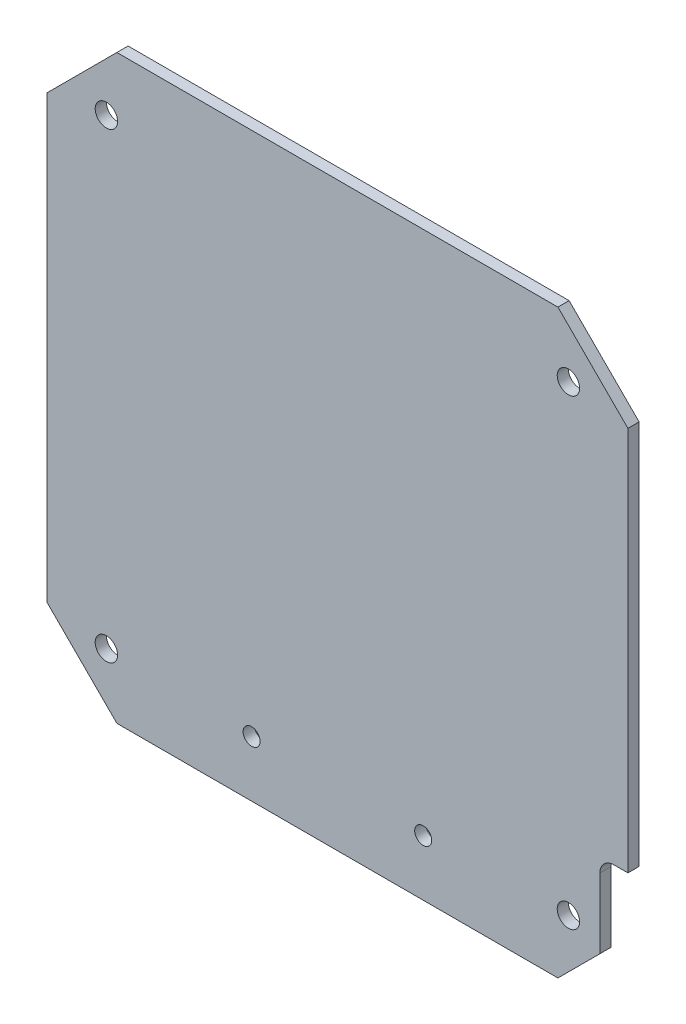
ISO-10303-21;
HEADER;
FILE_DESCRIPTION(('STEP AP214'),'2;1');
FILE_NAME('part.step','',(''),(''),'','','');
FILE_SCHEMA(('AUTOMOTIVE_DESIGN { 1 0 10303 214 1 1 1 1 }'));
ENDSEC;
DATA;
#1=APPLICATION_CONTEXT('core data for automotive mechanical design processes');
#2=APPLICATION_PROTOCOL_DEFINITION('international standard','automotive_design',2000,#1);
#3=PRODUCT_CONTEXT('',#1,'mechanical');
#4=PRODUCT('Part','Part','',(#3));
#5=PRODUCT_RELATED_PRODUCT_CATEGORY('part','',(#4));
#6=PRODUCT_DEFINITION_FORMATION('','',#4);
#7=PRODUCT_DEFINITION_CONTEXT('part definition',#1,'design');
#8=PRODUCT_DEFINITION('design','',#6,#7);
#9=PRODUCT_DEFINITION_SHAPE('','',#8);
#10=(LENGTH_UNIT() NAMED_UNIT(*) SI_UNIT(.MILLI.,.METRE.));
#11=(NAMED_UNIT(*) PLANE_ANGLE_UNIT() SI_UNIT($,.RADIAN.));
#12=(NAMED_UNIT(*) SI_UNIT($,.STERADIAN.) SOLID_ANGLE_UNIT());
#13=UNCERTAINTY_MEASURE_WITH_UNIT(LENGTH_MEASURE(1.E-05),#10,'distance_accuracy_value','');
#14=(GEOMETRIC_REPRESENTATION_CONTEXT(3) GLOBAL_UNCERTAINTY_ASSIGNED_CONTEXT((#13)) GLOBAL_UNIT_ASSIGNED_CONTEXT((#10,
#11,#12)) REPRESENTATION_CONTEXT('',''));
#15=CARTESIAN_POINT('',(0.,0.,0.));
#16=DIRECTION('',(0.,0.,1.));
#17=DIRECTION('',(1.,0.,0.));
#18=AXIS2_PLACEMENT_3D('',#15,#16,#17);
#19=CARTESIAN_POINT('',(0.,0.,1.6));
#20=DIRECTION('',(0.,0.,1.));
#21=DIRECTION('',(1.,0.,0.));
#22=AXIS2_PLACEMENT_3D('',#19,#20,#21);
#23=PLANE('',#22);
#24=CARTESIAN_POINT('',(33.,-33.,1.6));
#25=DIRECTION('',(0.,0.,-1.));
#26=DIRECTION('',(-1.,0.,0.));
#27=AXIS2_PLACEMENT_3D('',#24,#25,#26);
#28=CIRCLE('',#27,1.6);
#29=CARTESIAN_POINT('',(31.4,-33.,1.6));
#30=VERTEX_POINT('',#29);
#31=EDGE_CURVE('E183',#30,#30,#28,.T.);
#32=ORIENTED_EDGE('',*,*,#31,.T.);
#33=EDGE_LOOP('',(#32));
#34=FACE_BOUND('',#33,.T.);
#35=CARTESIAN_POINT('',(-33.,-33.,1.6));
#36=DIRECTION('',(0.,0.,-1.));
#37=DIRECTION('',(-1.,0.,0.));
#38=AXIS2_PLACEMENT_3D('',#35,#36,#37);
#39=CIRCLE('',#38,1.6);
#40=CARTESIAN_POINT('',(-34.6,-33.,1.6));
#41=VERTEX_POINT('',#40);
#42=EDGE_CURVE('E186',#41,#41,#39,.T.);
#43=ORIENTED_EDGE('',*,*,#42,.T.);
#44=EDGE_LOOP('',(#43));
#45=FACE_BOUND('',#44,.T.);
#46=CARTESIAN_POINT('',(33.,33.,1.6));
#47=DIRECTION('',(0.,0.,-1.));
#48=DIRECTION('',(-1.,0.,0.));
#49=AXIS2_PLACEMENT_3D('',#46,#47,#48);
#50=CIRCLE('',#49,1.6);
#51=CARTESIAN_POINT('',(31.4,33.,1.6));
#52=VERTEX_POINT('',#51);
#53=EDGE_CURVE('E189',#52,#52,#50,.T.);
#54=ORIENTED_EDGE('',*,*,#53,.T.);
#55=EDGE_LOOP('',(#54));
#56=FACE_BOUND('',#55,.T.);
#57=CARTESIAN_POINT('',(-33.,33.,1.6));
#58=DIRECTION('',(0.,0.,-1.));
#59=DIRECTION('',(-1.,0.,0.));
#60=AXIS2_PLACEMENT_3D('',#57,#58,#59);
#61=CIRCLE('',#60,1.6);
#62=CARTESIAN_POINT('',(-34.6,33.,1.6));
#63=VERTEX_POINT('',#62);
#64=EDGE_CURVE('E192',#63,#63,#61,.T.);
#65=ORIENTED_EDGE('',*,*,#64,.T.);
#66=EDGE_LOOP('',(#65));
#67=FACE_BOUND('',#66,.T.);
#68=CARTESIAN_POINT('',(-12.255,-33.5,1.6));
#69=DIRECTION('',(0.,0.,1.));
#70=DIRECTION('',(1.,0.,0.));
#71=AXIS2_PLACEMENT_3D('',#68,#69,#70);
#72=CIRCLE('',#71,1.215);
#73=CARTESIAN_POINT('',(-11.04,-33.5,1.6));
#74=VERTEX_POINT('',#73);
#75=EDGE_CURVE('E195',#74,#74,#72,.F.);
#76=ORIENTED_EDGE('',*,*,#75,.T.);
#77=EDGE_LOOP('',(#76));
#78=FACE_BOUND('',#77,.T.);
#79=CARTESIAN_POINT('',(12.255,-33.5,1.6));
#80=DIRECTION('',(0.,0.,1.));
#81=DIRECTION('',(1.,0.,0.));
#82=AXIS2_PLACEMENT_3D('',#79,#80,#81);
#83=CIRCLE('',#82,1.215);
#84=CARTESIAN_POINT('',(13.47,-33.5,1.6));
#85=VERTEX_POINT('',#84);
#86=EDGE_CURVE('E111',#85,#85,#83,.F.);
#87=ORIENTED_EDGE('',*,*,#86,.T.);
#88=EDGE_LOOP('',(#87));
#89=FACE_BOUND('',#88,.T.);
#90=DIRECTION('',(-0.707106781186548,-0.707106781186548,0.));
#91=VECTOR('',#90,1.);
#92=CARTESIAN_POINT('',(31.5,-41.5,1.6));
#93=LINE('',#92,#91);
#94=CARTESIAN_POINT('',(31.5,-41.5,1.6));
#95=VERTEX_POINT('',#94);
#96=CARTESIAN_POINT('',(37.5,-35.5,1.6));
#97=VERTEX_POINT('',#96);
#98=EDGE_CURVE('E114',#95,#97,#93,.F.);
#99=ORIENTED_EDGE('',*,*,#98,.T.);
#100=DIRECTION('',(0.,1.,0.));
#101=VECTOR('',#100,1.);
#102=CARTESIAN_POINT('',(37.5,-23.5,1.6));
#103=LINE('',#102,#101);
#104=CARTESIAN_POINT('',(37.5,-25.5,1.6));
#105=VERTEX_POINT('',#104);
#106=EDGE_CURVE('E108',#105,#97,#103,.F.);
#107=ORIENTED_EDGE('',*,*,#106,.F.);
#108=CARTESIAN_POINT('',(39.5,-25.5,1.6));
#109=DIRECTION('',(0.,0.,-1.));
#110=DIRECTION('',(-1.,0.,0.));
#111=AXIS2_PLACEMENT_3D('',#108,#109,#110);
#112=CIRCLE('',#111,2.);
#113=CARTESIAN_POINT('',(39.5,-23.5,1.6));
#114=VERTEX_POINT('',#113);
#115=EDGE_CURVE('E20',#105,#114,#112,.T.);
#116=ORIENTED_EDGE('',*,*,#115,.T.);
#117=DIRECTION('',(1.,0.,0.));
#118=VECTOR('',#117,1.);
#119=CARTESIAN_POINT('',(37.5,-23.5,1.6));
#120=LINE('',#119,#118);
#121=CARTESIAN_POINT('',(41.5,-23.5,1.6));
#122=VERTEX_POINT('',#121);
#123=EDGE_CURVE('E106',#114,#122,#120,.T.);
#124=ORIENTED_EDGE('',*,*,#123,.T.);
#125=DIRECTION('',(0.,1.,0.));
#126=VECTOR('',#125,1.);
#127=CARTESIAN_POINT('',(41.5,41.5,1.6));
#128=LINE('',#127,#126);
#129=CARTESIAN_POINT('',(41.5,31.5,1.6));
#130=VERTEX_POINT('',#129);
#131=EDGE_CURVE('E158',#122,#130,#128,.T.);
#132=ORIENTED_EDGE('',*,*,#131,.T.);
#133=DIRECTION('',(0.707106781186548,-0.707106781186548,0.));
#134=VECTOR('',#133,1.);
#135=CARTESIAN_POINT('',(31.5,41.5,1.6));
#136=LINE('',#135,#134);
#137=CARTESIAN_POINT('',(31.5,41.5,1.6));
#138=VERTEX_POINT('',#137);
#139=EDGE_CURVE('E152',#130,#138,#136,.F.);
#140=ORIENTED_EDGE('',*,*,#139,.T.);
#141=DIRECTION('',(1.,0.,0.));
#142=VECTOR('',#141,1.);
#143=CARTESIAN_POINT('',(-41.5,41.5,1.6));
#144=LINE('',#143,#142);
#145=CARTESIAN_POINT('',(-31.5,41.5,1.6));
#146=VERTEX_POINT('',#145);
#147=EDGE_CURVE('E144',#138,#146,#144,.F.);
#148=ORIENTED_EDGE('',*,*,#147,.T.);
#149=DIRECTION('',(-0.707106781186548,-0.707106781186548,0.));
#150=VECTOR('',#149,1.);
#151=CARTESIAN_POINT('',(-31.5,41.5,1.6));
#152=LINE('',#151,#150);
#153=CARTESIAN_POINT('',(-41.5,31.5,1.6));
#154=VERTEX_POINT('',#153);
#155=EDGE_CURVE('E142',#154,#146,#152,.F.);
#156=ORIENTED_EDGE('',*,*,#155,.F.);
#157=DIRECTION('',(0.,-1.,0.));
#158=VECTOR('',#157,1.);
#159=CARTESIAN_POINT('',(-41.5,41.5,1.6));
#160=LINE('',#159,#158);
#161=CARTESIAN_POINT('',(-41.5,-31.5,1.6));
#162=VERTEX_POINT('',#161);
#163=EDGE_CURVE('E137',#162,#154,#160,.F.);
#164=ORIENTED_EDGE('',*,*,#163,.F.);
#165=DIRECTION('',(0.707106781186548,-0.707106781186548,0.));
#166=VECTOR('',#165,1.);
#167=CARTESIAN_POINT('',(-31.5,-41.5,1.6));
#168=LINE('',#167,#166);
#169=CARTESIAN_POINT('',(-31.5,-41.5,1.6));
#170=VERTEX_POINT('',#169);
#171=EDGE_CURVE('E131',#170,#162,#168,.F.);
#172=ORIENTED_EDGE('',*,*,#171,.F.);
#173=DIRECTION('',(1.,0.,0.));
#174=VECTOR('',#173,1.);
#175=CARTESIAN_POINT('',(41.5,-41.5,1.6));
#176=LINE('',#175,#174);
#177=EDGE_CURVE('E126',#170,#95,#176,.T.);
#178=ORIENTED_EDGE('',*,*,#177,.T.);
#179=EDGE_LOOP('',(#99,#107,#116,#124,#132,#140,#148,#156,#164,#172,#178));
#180=FACE_BOUND('',#179,.T.);
#181=ADVANCED_FACE('F17',(#34,#45,#56,#67,#78,#89,#180),#23,.T.);
#182=CARTESIAN_POINT('',(39.5,-25.5,0.8));
#183=DIRECTION('',(0.,0.,-1.));
#184=DIRECTION('',(-1.,0.,0.));
#185=AXIS2_PLACEMENT_3D('',#182,#183,#184);
#186=CYLINDRICAL_SURFACE('',#185,2.);
#187=CARTESIAN_POINT('',(39.5,-25.5,0.));
#188=DIRECTION('',(0.,0.,-1.));
#189=DIRECTION('',(-1.,0.,0.));
#190=AXIS2_PLACEMENT_3D('',#187,#188,#189);
#191=CIRCLE('',#190,2.);
#192=CARTESIAN_POINT('',(37.5,-25.5,0.));
#193=VERTEX_POINT('',#192);
#194=CARTESIAN_POINT('',(39.5,-23.5,0.));
#195=VERTEX_POINT('',#194);
#196=EDGE_CURVE('E180',#193,#195,#191,.T.);
#197=ORIENTED_EDGE('',*,*,#196,.T.);
#198=DIRECTION('',(0.,0.,1.));
#199=VECTOR('',#198,1.);
#200=CARTESIAN_POINT('',(39.5,-23.5,1.6));
#201=LINE('',#200,#199);
#202=EDGE_CURVE('E102',#195,#114,#201,.T.);
#203=ORIENTED_EDGE('',*,*,#202,.T.);
#204=ORIENTED_EDGE('',*,*,#115,.F.);
#205=DIRECTION('',(0.,0.,-1.));
#206=VECTOR('',#205,1.);
#207=CARTESIAN_POINT('',(37.5,-25.5,1.6));
#208=LINE('',#207,#206);
#209=EDGE_CURVE('E101',#193,#105,#208,.F.);
#210=ORIENTED_EDGE('',*,*,#209,.F.);
#211=EDGE_LOOP('',(#197,#203,#204,#210));
#212=FACE_BOUND('',#211,.T.);
#213=ADVANCED_FACE('F100',(#212),#186,.F.);
#214=CARTESIAN_POINT('',(37.5,-23.5,1.6));
#215=DIRECTION('',(0.,1.,0.));
#216=DIRECTION('',(0.,0.,1.));
#217=AXIS2_PLACEMENT_3D('',#214,#215,#216);
#218=PLANE('',#217);
#219=DIRECTION('',(1.,0.,0.));
#220=VECTOR('',#219,1.);
#221=CARTESIAN_POINT('',(0.,-23.5,0.));
#222=LINE('',#221,#220);
#223=CARTESIAN_POINT('',(41.5,-23.5,0.));
#224=VERTEX_POINT('',#223);
#225=EDGE_CURVE('E182',#195,#224,#222,.T.);
#226=ORIENTED_EDGE('',*,*,#225,.T.);
#227=DIRECTION('',(0.,0.,1.));
#228=VECTOR('',#227,1.);
#229=CARTESIAN_POINT('',(41.5,-23.5,0.));
#230=LINE('',#229,#228);
#231=EDGE_CURVE('E155',#224,#122,#230,.T.);
#232=ORIENTED_EDGE('',*,*,#231,.T.);
#233=ORIENTED_EDGE('',*,*,#123,.F.);
#234=ORIENTED_EDGE('',*,*,#202,.F.);
#235=EDGE_LOOP('',(#226,#232,#233,#234));
#236=FACE_BOUND('',#235,.T.);
#237=ADVANCED_FACE('F290',(#236),#218,.F.);
#238=CARTESIAN_POINT('',(41.5,41.5,0.));
#239=DIRECTION('',(-1.,0.,0.));
#240=DIRECTION('',(0.,0.,1.));
#241=AXIS2_PLACEMENT_3D('',#238,#239,#240);
#242=PLANE('',#241);
#243=DIRECTION('',(0.,1.,0.));
#244=VECTOR('',#243,1.);
#245=CARTESIAN_POINT('',(41.5,0.,0.));
#246=LINE('',#245,#244);
#247=CARTESIAN_POINT('',(41.5,31.5,0.));
#248=VERTEX_POINT('',#247);
#249=EDGE_CURVE('E274',#224,#248,#246,.T.);
#250=ORIENTED_EDGE('',*,*,#249,.T.);
#251=DIRECTION('',(0.,0.,1.));
#252=VECTOR('',#251,1.);
#253=CARTESIAN_POINT('',(41.5,31.5,1.92));
#254=LINE('',#253,#252);
#255=EDGE_CURVE('E154',#248,#130,#254,.T.);
#256=ORIENTED_EDGE('',*,*,#255,.T.);
#257=ORIENTED_EDGE('',*,*,#131,.F.);
#258=ORIENTED_EDGE('',*,*,#231,.F.);
#259=EDGE_LOOP('',(#250,#256,#257,#258));
#260=FACE_BOUND('',#259,.T.);
#261=ADVANCED_FACE('F294',(#260),#242,.F.);
#262=CARTESIAN_POINT('',(31.5,41.5,1.92));
#263=DIRECTION('',(-0.707106781186548,-0.707106781186548,0.));
#264=DIRECTION('',(0.707106781186548,-0.707106781186548,0.));
#265=AXIS2_PLACEMENT_3D('',#262,#263,#264);
#266=PLANE('',#265);
#267=DIRECTION('',(-0.707106781186548,0.707106781186548,0.));
#268=VECTOR('',#267,1.);
#269=CARTESIAN_POINT('',(41.5,31.5,0.));
#270=LINE('',#269,#268);
#271=CARTESIAN_POINT('',(31.5,41.5,0.));
#272=VERTEX_POINT('',#271);
#273=EDGE_CURVE('E265',#248,#272,#270,.T.);
#274=ORIENTED_EDGE('',*,*,#273,.T.);
#275=DIRECTION('',(0.,0.,-1.));
#276=VECTOR('',#275,1.);
#277=CARTESIAN_POINT('',(31.5,41.5,0.));
#278=LINE('',#277,#276);
#279=EDGE_CURVE('E149',#272,#138,#278,.F.);
#280=ORIENTED_EDGE('',*,*,#279,.T.);
#281=ORIENTED_EDGE('',*,*,#139,.F.);
#282=ORIENTED_EDGE('',*,*,#255,.F.);
#283=EDGE_LOOP('',(#274,#280,#281,#282));
#284=FACE_BOUND('',#283,.T.);
#285=ADVANCED_FACE('F299',(#284),#266,.F.);
#286=CARTESIAN_POINT('',(-41.5,41.5,0.));
#287=DIRECTION('',(0.,-1.,0.));
#288=DIRECTION('',(0.,0.,-1.));
#289=AXIS2_PLACEMENT_3D('',#286,#287,#288);
#290=PLANE('',#289);
#291=ORIENTED_EDGE('',*,*,#147,.F.);
#292=ORIENTED_EDGE('',*,*,#279,.F.);
#293=DIRECTION('',(1.,0.,0.));
#294=VECTOR('',#293,1.);
#295=CARTESIAN_POINT('',(0.,41.5,0.));
#296=LINE('',#295,#294);
#297=CARTESIAN_POINT('',(-31.5,41.5,0.));
#298=VERTEX_POINT('',#297);
#299=EDGE_CURVE('E257',#272,#298,#296,.F.);
#300=ORIENTED_EDGE('',*,*,#299,.T.);
#301=DIRECTION('',(0.,0.,1.));
#302=VECTOR('',#301,1.);
#303=CARTESIAN_POINT('',(-31.5,41.5,1.92));
#304=LINE('',#303,#302);
#305=EDGE_CURVE('E139',#146,#298,#304,.F.);
#306=ORIENTED_EDGE('',*,*,#305,.F.);
#307=EDGE_LOOP('',(#291,#292,#300,#306));
#308=FACE_BOUND('',#307,.T.);
#309=ADVANCED_FACE('F304',(#308),#290,.F.);
#310=CARTESIAN_POINT('',(-31.5,41.5,1.92));
#311=DIRECTION('',(-0.707106781186548,0.707106781186548,0.));
#312=DIRECTION('',(-0.707106781186548,-0.707106781186548,0.));
#313=AXIS2_PLACEMENT_3D('',#310,#311,#312);
#314=PLANE('',#313);
#315=DIRECTION('',(-0.707106781186548,-0.707106781186548,0.));
#316=VECTOR('',#315,1.);
#317=CARTESIAN_POINT('',(-31.5,41.5,0.));
#318=LINE('',#317,#316);
#319=CARTESIAN_POINT('',(-41.5,31.5,0.));
#320=VERTEX_POINT('',#319);
#321=EDGE_CURVE('E249',#298,#320,#318,.T.);
#322=ORIENTED_EDGE('',*,*,#321,.T.);
#323=DIRECTION('',(0.,0.,1.));
#324=VECTOR('',#323,1.);
#325=CARTESIAN_POINT('',(-41.5,31.5,0.));
#326=LINE('',#325,#324);
#327=EDGE_CURVE('E134',#154,#320,#326,.F.);
#328=ORIENTED_EDGE('',*,*,#327,.F.);
#329=ORIENTED_EDGE('',*,*,#155,.T.);
#330=ORIENTED_EDGE('',*,*,#305,.T.);
#331=EDGE_LOOP('',(#322,#328,#329,#330));
#332=FACE_BOUND('',#331,.T.);
#333=ADVANCED_FACE('F306',(#332),#314,.T.);
#334=CARTESIAN_POINT('',(-41.5,41.5,0.));
#335=DIRECTION('',(-1.,0.,0.));
#336=DIRECTION('',(0.,-1.,0.));
#337=AXIS2_PLACEMENT_3D('',#334,#335,#336);
#338=PLANE('',#337);
#339=DIRECTION('',(0.,1.,0.));
#340=VECTOR('',#339,1.);
#341=CARTESIAN_POINT('',(-41.5,0.,0.));
#342=LINE('',#341,#340);
#343=CARTESIAN_POINT('',(-41.5,-31.5,0.));
#344=VERTEX_POINT('',#343);
#345=EDGE_CURVE('E231',#320,#344,#342,.F.);
#346=ORIENTED_EDGE('',*,*,#345,.T.);
#347=DIRECTION('',(0.,0.,1.));
#348=VECTOR('',#347,1.);
#349=CARTESIAN_POINT('',(-41.5,-31.5,-0.32));
#350=LINE('',#349,#348);
#351=EDGE_CURVE('E133',#162,#344,#350,.F.);
#352=ORIENTED_EDGE('',*,*,#351,.F.);
#353=ORIENTED_EDGE('',*,*,#163,.T.);
#354=ORIENTED_EDGE('',*,*,#327,.T.);
#355=EDGE_LOOP('',(#346,#352,#353,#354));
#356=FACE_BOUND('',#355,.T.);
#357=ADVANCED_FACE('F311',(#356),#338,.T.);
#358=CARTESIAN_POINT('',(-31.5,-41.5,-0.32));
#359=DIRECTION('',(-0.707106781186548,-0.707106781186548,0.));
#360=DIRECTION('',(0.707106781186548,-0.707106781186548,0.));
#361=AXIS2_PLACEMENT_3D('',#358,#359,#360);
#362=PLANE('',#361);
#363=DIRECTION('',(0.707106781186548,-0.707106781186548,0.));
#364=VECTOR('',#363,1.);
#365=CARTESIAN_POINT('',(-41.5,-31.5,0.));
#366=LINE('',#365,#364);
#367=CARTESIAN_POINT('',(-31.5,-41.5,0.));
#368=VERTEX_POINT('',#367);
#369=EDGE_CURVE('E229',#344,#368,#366,.T.);
#370=ORIENTED_EDGE('',*,*,#369,.T.);
#371=DIRECTION('',(0.,0.,1.));
#372=VECTOR('',#371,1.);
#373=CARTESIAN_POINT('',(-31.5,-41.5,0.));
#374=LINE('',#373,#372);
#375=EDGE_CURVE('E128',#368,#170,#374,.T.);
#376=ORIENTED_EDGE('',*,*,#375,.T.);
#377=ORIENTED_EDGE('',*,*,#171,.T.);
#378=ORIENTED_EDGE('',*,*,#351,.T.);
#379=EDGE_LOOP('',(#370,#376,#377,#378));
#380=FACE_BOUND('',#379,.T.);
#381=ADVANCED_FACE('F314',(#380),#362,.T.);
#382=CARTESIAN_POINT('',(41.5,-41.5,0.));
#383=DIRECTION('',(0.,1.,0.));
#384=DIRECTION('',(0.,0.,1.));
#385=AXIS2_PLACEMENT_3D('',#382,#383,#384);
#386=PLANE('',#385);
#387=ORIENTED_EDGE('',*,*,#177,.F.);
#388=ORIENTED_EDGE('',*,*,#375,.F.);
#389=DIRECTION('',(1.,0.,0.));
#390=VECTOR('',#389,1.);
#391=CARTESIAN_POINT('',(0.,-41.5,0.));
#392=LINE('',#391,#390);
#393=CARTESIAN_POINT('',(31.5,-41.5,0.));
#394=VERTEX_POINT('',#393);
#395=EDGE_CURVE('E220',#368,#394,#392,.T.);
#396=ORIENTED_EDGE('',*,*,#395,.T.);
#397=DIRECTION('',(0.,0.,1.));
#398=VECTOR('',#397,1.);
#399=CARTESIAN_POINT('',(31.5,-41.5,-0.32));
#400=LINE('',#399,#398);
#401=EDGE_CURVE('E117',#394,#95,#400,.T.);
#402=ORIENTED_EDGE('',*,*,#401,.T.);
#403=EDGE_LOOP('',(#387,#388,#396,#402));
#404=FACE_BOUND('',#403,.T.);
#405=ADVANCED_FACE('F227',(#404),#386,.F.);
#406=CARTESIAN_POINT('',(31.5,-41.5,-0.32));
#407=DIRECTION('',(-0.707106781186548,0.707106781186548,0.));
#408=DIRECTION('',(-0.707106781186548,-0.707106781186548,0.));
#409=AXIS2_PLACEMENT_3D('',#406,#407,#408);
#410=PLANE('',#409);
#411=ORIENTED_EDGE('',*,*,#98,.F.);
#412=ORIENTED_EDGE('',*,*,#401,.F.);
#413=DIRECTION('',(0.707106781186548,0.707106781186548,0.));
#414=VECTOR('',#413,1.);
#415=CARTESIAN_POINT('',(31.5,-41.5,0.));
#416=LINE('',#415,#414);
#417=CARTESIAN_POINT('',(37.5,-35.5,0.));
#418=VERTEX_POINT('',#417);
#419=EDGE_CURVE('E217',#394,#418,#416,.T.);
#420=ORIENTED_EDGE('',*,*,#419,.T.);
#421=DIRECTION('',(0.,0.,-1.));
#422=VECTOR('',#421,1.);
#423=CARTESIAN_POINT('',(37.5,-35.5,1.6));
#424=LINE('',#423,#422);
#425=EDGE_CURVE('E35',#97,#418,#424,.T.);
#426=ORIENTED_EDGE('',*,*,#425,.F.);
#427=EDGE_LOOP('',(#411,#412,#420,#426));
#428=FACE_BOUND('',#427,.T.);
#429=ADVANCED_FACE('F322',(#428),#410,.F.);
#430=CARTESIAN_POINT('',(37.5,-23.5,1.6));
#431=DIRECTION('',(1.,0.,0.));
#432=DIRECTION('',(0.,0.,-1.));
#433=AXIS2_PLACEMENT_3D('',#430,#431,#432);
#434=PLANE('',#433);
#435=DIRECTION('',(0.,1.,0.));
#436=VECTOR('',#435,1.);
#437=CARTESIAN_POINT('',(37.5,0.,0.));
#438=LINE('',#437,#436);
#439=EDGE_CURVE('E110',#418,#193,#438,.T.);
#440=ORIENTED_EDGE('',*,*,#439,.T.);
#441=ORIENTED_EDGE('',*,*,#209,.T.);
#442=ORIENTED_EDGE('',*,*,#106,.T.);
#443=ORIENTED_EDGE('',*,*,#425,.T.);
#444=EDGE_LOOP('',(#440,#441,#442,#443));
#445=FACE_BOUND('',#444,.T.);
#446=ADVANCED_FACE('F107',(#445),#434,.T.);
#447=CARTESIAN_POINT('',(12.255,-33.5,0.1));
#448=DIRECTION('',(0.,0.,1.));
#449=DIRECTION('',(1.,0.,0.));
#450=AXIS2_PLACEMENT_3D('',#447,#448,#449);
#451=CYLINDRICAL_SURFACE('',#450,1.215);
#452=ORIENTED_EDGE('',*,*,#86,.F.);
#453=EDGE_LOOP('',(#452));
#454=FACE_BOUND('',#453,.T.);
#455=CARTESIAN_POINT('',(12.255,-33.5,0.));
#456=DIRECTION('',(0.,0.,1.));
#457=DIRECTION('',(1.,0.,0.));
#458=AXIS2_PLACEMENT_3D('',#455,#456,#457);
#459=CIRCLE('',#458,1.215);
#460=CARTESIAN_POINT('',(13.47,-33.5,0.));
#461=VERTEX_POINT('',#460);
#462=EDGE_CURVE('E177',#461,#461,#459,.F.);
#463=ORIENTED_EDGE('',*,*,#462,.T.);
#464=EDGE_LOOP('',(#463));
#465=FACE_BOUND('',#464,.T.);
#466=ADVANCED_FACE('F201',(#454,#465),#451,.F.);
#467=CARTESIAN_POINT('',(-12.255,-33.5,0.1));
#468=DIRECTION('',(0.,0.,1.));
#469=DIRECTION('',(1.,0.,0.));
#470=AXIS2_PLACEMENT_3D('',#467,#468,#469);
#471=CYLINDRICAL_SURFACE('',#470,1.215);
#472=ORIENTED_EDGE('',*,*,#75,.F.);
#473=EDGE_LOOP('',(#472));
#474=FACE_BOUND('',#473,.T.);
#475=CARTESIAN_POINT('',(-12.255,-33.5,0.));
#476=DIRECTION('',(0.,0.,1.));
#477=DIRECTION('',(1.,0.,0.));
#478=AXIS2_PLACEMENT_3D('',#475,#476,#477);
#479=CIRCLE('',#478,1.215);
#480=CARTESIAN_POINT('',(-11.04,-33.5,0.));
#481=VERTEX_POINT('',#480);
#482=EDGE_CURVE('E174',#481,#481,#479,.F.);
#483=ORIENTED_EDGE('',*,*,#482,.T.);
#484=EDGE_LOOP('',(#483));
#485=FACE_BOUND('',#484,.T.);
#486=ADVANCED_FACE('F204',(#474,#485),#471,.F.);
#487=CARTESIAN_POINT('',(-33.,33.,1.5));
#488=DIRECTION('',(0.,0.,-1.));
#489=DIRECTION('',(-1.,0.,0.));
#490=AXIS2_PLACEMENT_3D('',#487,#488,#489);
#491=CYLINDRICAL_SURFACE('',#490,1.6);
#492=CARTESIAN_POINT('',(-33.,33.,0.));
#493=DIRECTION('',(0.,0.,-1.));
#494=DIRECTION('',(-1.,0.,0.));
#495=AXIS2_PLACEMENT_3D('',#492,#493,#494);
#496=CIRCLE('',#495,1.6);
#497=CARTESIAN_POINT('',(-34.6,33.,0.));
#498=VERTEX_POINT('',#497);
#499=EDGE_CURVE('E171',#498,#498,#496,.T.);
#500=ORIENTED_EDGE('',*,*,#499,.T.);
#501=EDGE_LOOP('',(#500));
#502=FACE_BOUND('',#501,.T.);
#503=ORIENTED_EDGE('',*,*,#64,.F.);
#504=EDGE_LOOP('',(#503));
#505=FACE_BOUND('',#504,.T.);
#506=ADVANCED_FACE('F355',(#502,#505),#491,.F.);
#507=CARTESIAN_POINT('',(33.,33.,1.5));
#508=DIRECTION('',(0.,0.,-1.));
#509=DIRECTION('',(-1.,0.,0.));
#510=AXIS2_PLACEMENT_3D('',#507,#508,#509);
#511=CYLINDRICAL_SURFACE('',#510,1.6);
#512=CARTESIAN_POINT('',(33.,33.,0.));
#513=DIRECTION('',(0.,0.,-1.));
#514=DIRECTION('',(-1.,0.,0.));
#515=AXIS2_PLACEMENT_3D('',#512,#513,#514);
#516=CIRCLE('',#515,1.6);
#517=CARTESIAN_POINT('',(31.4,33.,0.));
#518=VERTEX_POINT('',#517);
#519=EDGE_CURVE('E168',#518,#518,#516,.T.);
#520=ORIENTED_EDGE('',*,*,#519,.T.);
#521=EDGE_LOOP('',(#520));
#522=FACE_BOUND('',#521,.T.);
#523=ORIENTED_EDGE('',*,*,#53,.F.);
#524=EDGE_LOOP('',(#523));
#525=FACE_BOUND('',#524,.T.);
#526=ADVANCED_FACE('F362',(#522,#525),#511,.F.);
#527=CARTESIAN_POINT('',(-33.,-33.,1.5));
#528=DIRECTION('',(0.,0.,-1.));
#529=DIRECTION('',(-1.,0.,0.));
#530=AXIS2_PLACEMENT_3D('',#527,#528,#529);
#531=CYLINDRICAL_SURFACE('',#530,1.6);
#532=CARTESIAN_POINT('',(-33.,-33.,0.));
#533=DIRECTION('',(0.,0.,-1.));
#534=DIRECTION('',(-1.,0.,0.));
#535=AXIS2_PLACEMENT_3D('',#532,#533,#534);
#536=CIRCLE('',#535,1.6);
#537=CARTESIAN_POINT('',(-34.6,-33.,0.));
#538=VERTEX_POINT('',#537);
#539=EDGE_CURVE('E26',#538,#538,#536,.T.);
#540=ORIENTED_EDGE('',*,*,#539,.T.);
#541=EDGE_LOOP('',(#540));
#542=FACE_BOUND('',#541,.T.);
#543=ORIENTED_EDGE('',*,*,#42,.F.);
#544=EDGE_LOOP('',(#543));
#545=FACE_BOUND('',#544,.T.);
#546=ADVANCED_FACE('F415',(#542,#545),#531,.F.);
#547=CARTESIAN_POINT('',(33.,-33.,1.5));
#548=DIRECTION('',(0.,0.,-1.));
#549=DIRECTION('',(-1.,0.,0.));
#550=AXIS2_PLACEMENT_3D('',#547,#548,#549);
#551=CYLINDRICAL_SURFACE('',#550,1.6);
#552=CARTESIAN_POINT('',(33.,-33.,0.));
#553=DIRECTION('',(0.,0.,-1.));
#554=DIRECTION('',(-1.,0.,0.));
#555=AXIS2_PLACEMENT_3D('',#552,#553,#554);
#556=CIRCLE('',#555,1.6);
#557=CARTESIAN_POINT('',(31.4,-33.,0.));
#558=VERTEX_POINT('',#557);
#559=EDGE_CURVE('E11',#558,#558,#556,.T.);
#560=ORIENTED_EDGE('',*,*,#559,.T.);
#561=EDGE_LOOP('',(#560));
#562=FACE_BOUND('',#561,.T.);
#563=ORIENTED_EDGE('',*,*,#31,.F.);
#564=EDGE_LOOP('',(#563));
#565=FACE_BOUND('',#564,.T.);
#566=ADVANCED_FACE('F211',(#562,#565),#551,.F.);
#567=CARTESIAN_POINT('',(0.,0.,0.));
#568=DIRECTION('',(0.,0.,1.));
#569=DIRECTION('',(1.,0.,0.));
#570=AXIS2_PLACEMENT_3D('',#567,#568,#569);
#571=PLANE('',#570);
#572=ORIENTED_EDGE('',*,*,#559,.F.);
#573=EDGE_LOOP('',(#572));
#574=FACE_BOUND('',#573,.T.);
#575=ORIENTED_EDGE('',*,*,#539,.F.);
#576=EDGE_LOOP('',(#575));
#577=FACE_BOUND('',#576,.T.);
#578=ORIENTED_EDGE('',*,*,#519,.F.);
#579=EDGE_LOOP('',(#578));
#580=FACE_BOUND('',#579,.T.);
#581=ORIENTED_EDGE('',*,*,#499,.F.);
#582=EDGE_LOOP('',(#581));
#583=FACE_BOUND('',#582,.T.);
#584=ORIENTED_EDGE('',*,*,#482,.F.);
#585=EDGE_LOOP('',(#584));
#586=FACE_BOUND('',#585,.T.);
#587=ORIENTED_EDGE('',*,*,#462,.F.);
#588=EDGE_LOOP('',(#587));
#589=FACE_BOUND('',#588,.T.);
#590=ORIENTED_EDGE('',*,*,#419,.F.);
#591=ORIENTED_EDGE('',*,*,#395,.F.);
#592=ORIENTED_EDGE('',*,*,#369,.F.);
#593=ORIENTED_EDGE('',*,*,#345,.F.);
#594=ORIENTED_EDGE('',*,*,#321,.F.);
#595=ORIENTED_EDGE('',*,*,#299,.F.);
#596=ORIENTED_EDGE('',*,*,#273,.F.);
#597=ORIENTED_EDGE('',*,*,#249,.F.);
#598=ORIENTED_EDGE('',*,*,#225,.F.);
#599=ORIENTED_EDGE('',*,*,#196,.F.);
#600=ORIENTED_EDGE('',*,*,#439,.F.);
#601=EDGE_LOOP('',(#590,#591,#592,#593,#594,#595,#596,#597,#598,#599,#600));
#602=FACE_BOUND('',#601,.T.);
#603=ADVANCED_FACE('F208',(#574,#577,#580,#583,#586,#589,#602),#571,.F.);
#604=CLOSED_SHELL('',(#181,#213,#237,#261,#285,#309,#333,#357,#381,#405,#429,#446,#466,#486,
#506,#526,#546,#566,#603));
#605=MANIFOLD_SOLID_BREP('B1',#604);
#606=ADVANCED_BREP_SHAPE_REPRESENTATION('',(#18,#605),#14);
#607=SHAPE_DEFINITION_REPRESENTATION(#9,#606);
ENDSEC;
END-ISO-10303-21;
